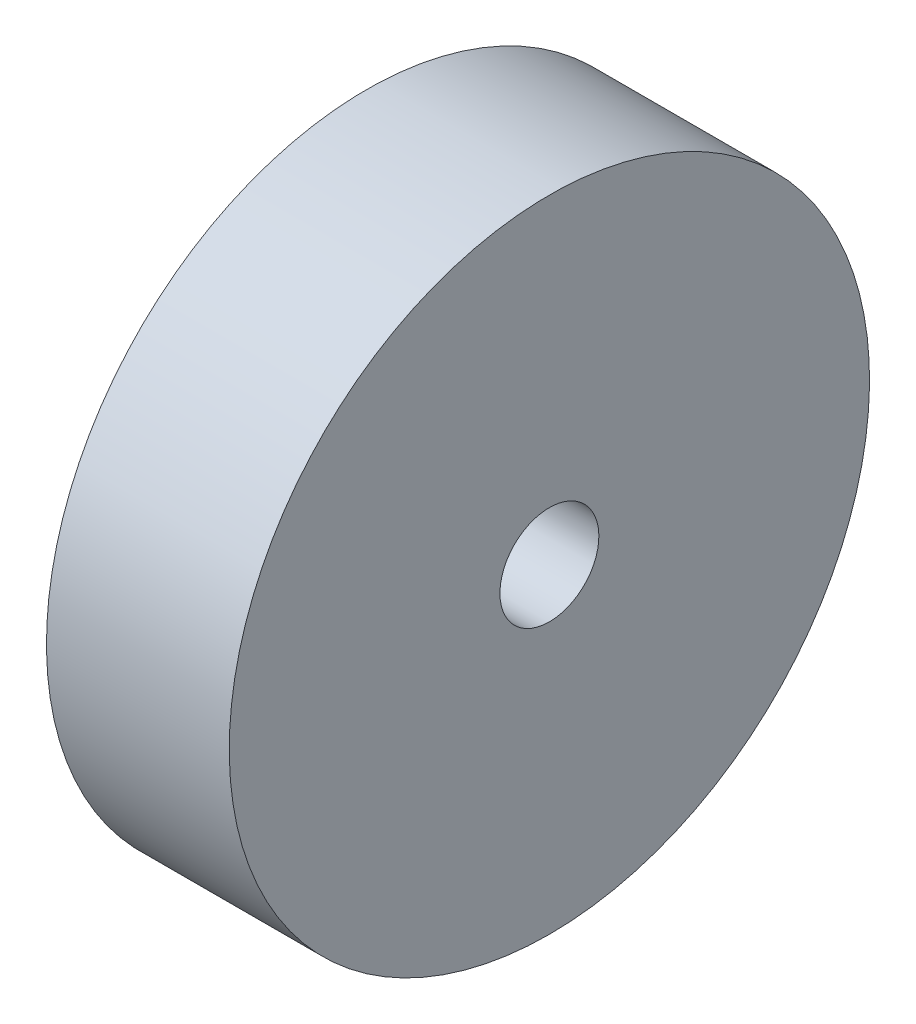
ISO-10303-21;
HEADER;
FILE_DESCRIPTION(('STEP AP214'),'2;1');
FILE_NAME('part.step','',(''),(''),'','','');
FILE_SCHEMA(('AUTOMOTIVE_DESIGN { 1 0 10303 214 1 1 1 1 }'));
ENDSEC;
DATA;
#1=APPLICATION_CONTEXT('core data for automotive mechanical design processes');
#2=APPLICATION_PROTOCOL_DEFINITION('international standard','automotive_design',2000,#1);
#3=PRODUCT_CONTEXT('',#1,'mechanical');
#4=PRODUCT('Part','Part','',(#3));
#5=PRODUCT_RELATED_PRODUCT_CATEGORY('part','',(#4));
#6=PRODUCT_DEFINITION_FORMATION('','',#4);
#7=PRODUCT_DEFINITION_CONTEXT('part definition',#1,'design');
#8=PRODUCT_DEFINITION('design','',#6,#7);
#9=PRODUCT_DEFINITION_SHAPE('','',#8);
#10=(LENGTH_UNIT() NAMED_UNIT(*) SI_UNIT(.MILLI.,.METRE.));
#11=(NAMED_UNIT(*) PLANE_ANGLE_UNIT() SI_UNIT($,.RADIAN.));
#12=(NAMED_UNIT(*) SI_UNIT($,.STERADIAN.) SOLID_ANGLE_UNIT());
#13=UNCERTAINTY_MEASURE_WITH_UNIT(LENGTH_MEASURE(1.E-05),#10,'distance_accuracy_value','');
#14=(GEOMETRIC_REPRESENTATION_CONTEXT(3) GLOBAL_UNCERTAINTY_ASSIGNED_CONTEXT((#13)) GLOBAL_UNIT_ASSIGNED_CONTEXT((#10,
#11,#12)) REPRESENTATION_CONTEXT('',''));
#15=CARTESIAN_POINT('',(0.,0.,0.));
#16=DIRECTION('',(0.,0.,1.));
#17=DIRECTION('',(1.,0.,0.));
#18=AXIS2_PLACEMENT_3D('',#15,#16,#17);
#19=CARTESIAN_POINT('',(-0.785,2.75,0.));
#20=DIRECTION('',(1.,0.,0.));
#21=DIRECTION('',(0.,1.,0.));
#22=AXIS2_PLACEMENT_3D('',#19,#20,#21);
#23=PLANE('',#22);
#24=CARTESIAN_POINT('',(-0.785,0.,0.));
#25=DIRECTION('',(-1.,0.,0.));
#26=DIRECTION('',(0.,-1.,0.));
#27=AXIS2_PLACEMENT_3D('',#24,#25,#26);
#28=CIRCLE('',#27,0.425);
#29=CARTESIAN_POINT('',(-0.785,-0.425,0.));
#30=VERTEX_POINT('',#29);
#31=EDGE_CURVE('E10',#30,#30,#28,.T.);
#32=ORIENTED_EDGE('',*,*,#31,.F.);
#33=EDGE_LOOP('',(#32));
#34=FACE_BOUND('',#33,.T.);
#35=CARTESIAN_POINT('',(-0.785,0.,0.));
#36=DIRECTION('',(-1.,0.,0.));
#37=DIRECTION('',(0.,-1.,0.));
#38=AXIS2_PLACEMENT_3D('',#35,#36,#37);
#39=CIRCLE('',#38,2.75);
#40=CARTESIAN_POINT('',(-0.784999999999999,-2.75,0.));
#41=VERTEX_POINT('',#40);
#42=EDGE_CURVE('E54',#41,#41,#39,.T.);
#43=ORIENTED_EDGE('',*,*,#42,.T.);
#44=EDGE_LOOP('',(#43));
#45=FACE_BOUND('',#44,.T.);
#46=ADVANCED_FACE('F37',(#34,#45),#23,.F.);
#47=CARTESIAN_POINT('',(-0.785,0.,0.));
#48=DIRECTION('',(-1.,0.,0.));
#49=DIRECTION('',(0.,-1.,0.));
#50=AXIS2_PLACEMENT_3D('',#47,#48,#49);
#51=CYLINDRICAL_SURFACE('',#50,0.425);
#52=CARTESIAN_POINT('',(0.785,0.,0.));
#53=DIRECTION('',(-1.,0.,0.));
#54=DIRECTION('',(0.,-1.,0.));
#55=AXIS2_PLACEMENT_3D('',#52,#53,#54);
#56=CIRCLE('',#55,0.425);
#57=CARTESIAN_POINT('',(0.785,-0.424999999999999,0.));
#58=VERTEX_POINT('',#57);
#59=EDGE_CURVE('E44',#58,#58,#56,.T.);
#60=ORIENTED_EDGE('',*,*,#59,.F.);
#61=EDGE_LOOP('',(#60));
#62=FACE_BOUND('',#61,.T.);
#63=ORIENTED_EDGE('',*,*,#31,.T.);
#64=EDGE_LOOP('',(#63));
#65=FACE_BOUND('',#64,.T.);
#66=ADVANCED_FACE('F70',(#62,#65),#51,.F.);
#67=CARTESIAN_POINT('',(0.785,2.75,0.));
#68=DIRECTION('',(-1.,0.,0.));
#69=DIRECTION('',(0.,-1.,0.));
#70=AXIS2_PLACEMENT_3D('',#67,#68,#69);
#71=PLANE('',#70);
#72=CARTESIAN_POINT('',(0.785,0.,0.));
#73=DIRECTION('',(-1.,0.,0.));
#74=DIRECTION('',(0.,-1.,0.));
#75=AXIS2_PLACEMENT_3D('',#72,#73,#74);
#76=CIRCLE('',#75,2.75);
#77=CARTESIAN_POINT('',(0.785000000000001,-2.75,0.));
#78=VERTEX_POINT('',#77);
#79=EDGE_CURVE('E49',#78,#78,#76,.T.);
#80=ORIENTED_EDGE('',*,*,#79,.F.);
#81=EDGE_LOOP('',(#80));
#82=FACE_BOUND('',#81,.T.);
#83=ORIENTED_EDGE('',*,*,#59,.T.);
#84=EDGE_LOOP('',(#83));
#85=FACE_BOUND('',#84,.T.);
#86=ADVANCED_FACE('F65',(#82,#85),#71,.F.);
#87=CARTESIAN_POINT('',(-0.785,0.,0.));
#88=DIRECTION('',(-1.,0.,0.));
#89=DIRECTION('',(0.,-1.,0.));
#90=AXIS2_PLACEMENT_3D('',#87,#88,#89);
#91=CYLINDRICAL_SURFACE('',#90,2.75);
#92=ORIENTED_EDGE('',*,*,#42,.F.);
#93=EDGE_LOOP('',(#92));
#94=FACE_BOUND('',#93,.T.);
#95=ORIENTED_EDGE('',*,*,#79,.T.);
#96=EDGE_LOOP('',(#95));
#97=FACE_BOUND('',#96,.T.);
#98=ADVANCED_FACE('F62',(#94,#97),#91,.T.);
#99=CLOSED_SHELL('',(#46,#66,#86,#98));
#100=MANIFOLD_SOLID_BREP('B2',#99);
#101=ADVANCED_BREP_SHAPE_REPRESENTATION('',(#18,#100),#14);
#102=SHAPE_DEFINITION_REPRESENTATION(#9,#101);
ENDSEC;
END-ISO-10303-21;
